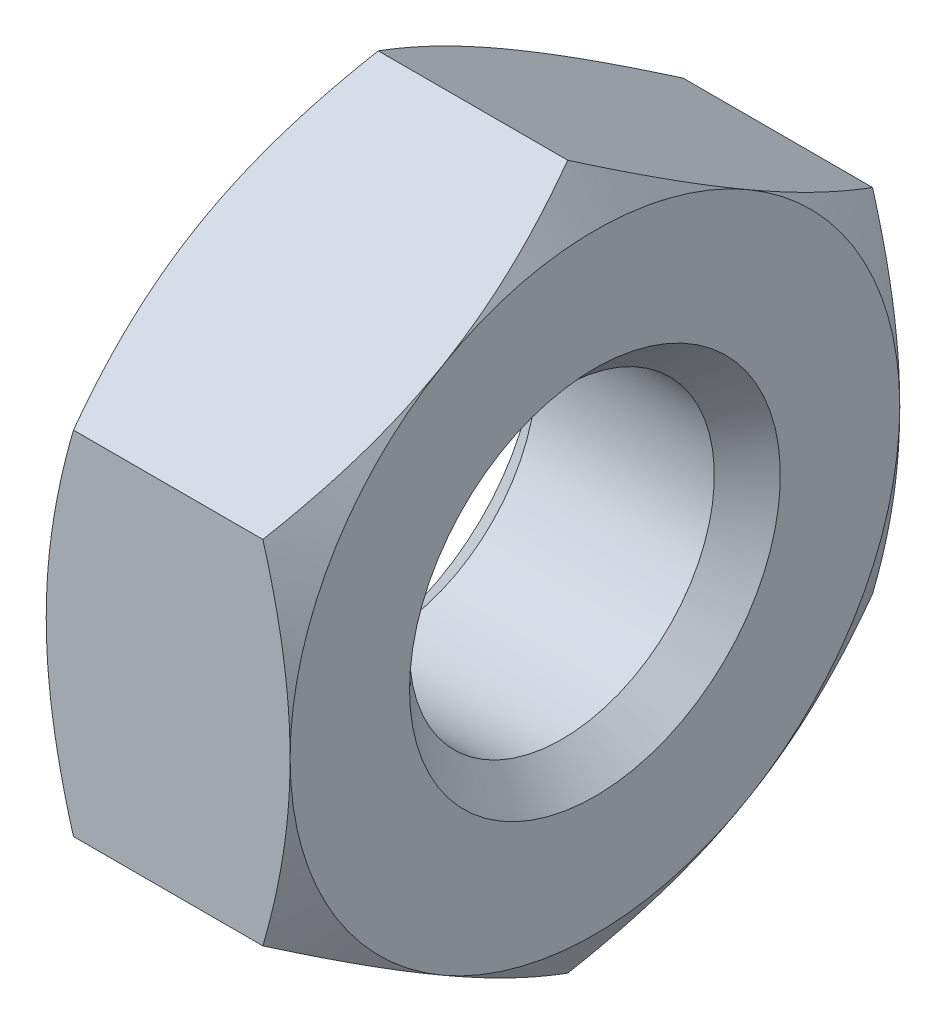
ISO-10303-21;
HEADER;
FILE_DESCRIPTION(('STEP AP214'),'2;1');
FILE_NAME('part.step','',(''),(''),'','','');
FILE_SCHEMA(('AUTOMOTIVE_DESIGN { 1 0 10303 214 1 1 1 1 }'));
ENDSEC;
DATA;
#1=APPLICATION_CONTEXT('core data for automotive mechanical design processes');
#2=APPLICATION_PROTOCOL_DEFINITION('international standard','automotive_design',2000,#1);
#3=PRODUCT_CONTEXT('',#1,'mechanical');
#4=PRODUCT('Part','Part','',(#3));
#5=PRODUCT_RELATED_PRODUCT_CATEGORY('part','',(#4));
#6=PRODUCT_DEFINITION_FORMATION('','',#4);
#7=PRODUCT_DEFINITION_CONTEXT('part definition',#1,'design');
#8=PRODUCT_DEFINITION('design','',#6,#7);
#9=PRODUCT_DEFINITION_SHAPE('','',#8);
#10=(LENGTH_UNIT() NAMED_UNIT(*) SI_UNIT(.MILLI.,.METRE.));
#11=(NAMED_UNIT(*) PLANE_ANGLE_UNIT() SI_UNIT($,.RADIAN.));
#12=(NAMED_UNIT(*) SI_UNIT($,.STERADIAN.) SOLID_ANGLE_UNIT());
#13=UNCERTAINTY_MEASURE_WITH_UNIT(LENGTH_MEASURE(1.E-05),#10,'distance_accuracy_value','');
#14=(GEOMETRIC_REPRESENTATION_CONTEXT(3) GLOBAL_UNCERTAINTY_ASSIGNED_CONTEXT((#13)) GLOBAL_UNIT_ASSIGNED_CONTEXT((#10,
#11,#12)) REPRESENTATION_CONTEXT('',''));
#15=CARTESIAN_POINT('',(0.,0.,0.));
#16=DIRECTION('',(0.,0.,1.));
#17=DIRECTION('',(1.,0.,0.));
#18=AXIS2_PLACEMENT_3D('',#15,#16,#17);
#19=CARTESIAN_POINT('',(0.,0.,0.));
#20=DIRECTION('',(1.,0.,0.));
#21=DIRECTION('',(0.,0.,-1.));
#22=AXIS2_PLACEMENT_3D('',#19,#20,#21);
#23=CONICAL_SURFACE('',#22,2.,1.0471975511966);
#24=CARTESIAN_POINT('',(0.178633461621249,2.30940223145904,1.99999999944489E-06));
#25=CARTESIAN_POINT('',(0.149328951990776,2.25866011643009,-0.087885921313644));
#26=CARTESIAN_POINT('',(0.122678025802622,2.207479996229,-0.176532489839423));
#27=CARTESIAN_POINT('',(0.0761596153889572,2.10423360469229,-0.355360485679156));
#28=CARTESIAN_POINT('',(0.0563085858506981,2.0521654994535,-0.445545089406573));
#29=CARTESIAN_POINT('',(0.0254090009490563,1.94867454348799,-0.624796683262704));
#30=CARTESIAN_POINT('',(0.0141547681894489,1.89726761179017,-0.71383610082456));
#31=CARTESIAN_POINT('',(0.000722030029472363,1.79421198570273,-0.89233368121383));
#32=CARTESIAN_POINT('',(-0.00146760146008391,1.74256366563992,-0.981791195688201));
#33=CARTESIAN_POINT('',(0.00309900412138308,1.64606416810295,-1.14893322832709));
#34=CARTESIAN_POINT('',(0.0087339880982772,1.60119851072437,-1.22664282642177));
#35=CARTESIAN_POINT('',(0.0265900336654409,1.51175948134918,-1.38155576947924));
#36=CARTESIAN_POINT('',(0.0388171889850589,1.46718641847169,-1.45875857903201));
#37=CARTESIAN_POINT('',(0.0693827363733964,1.37756313348883,-1.61399066216355));
#38=CARTESIAN_POINT('',(0.0878506344597719,1.33252424880493,-1.69200029875231));
#39=CARTESIAN_POINT('',(0.129764965388754,1.2431180434402,-1.84685638895596));
#40=CARTESIAN_POINT('',(0.153201556234829,1.1987495782296,-1.92370482495456));
#41=CARTESIAN_POINT('',(0.178633461621249,1.15469938367871,-2.000002));
#42=B_SPLINE_CURVE_WITH_KNOTS('',3,(#24,#25,#26,#27,#28,#29,#30,#31,#32,#33,#34,#35,#36,#37,#38,
#39,#40,#41),.UNSPECIFIED.,.F.,.F.,(4,2,2,2,2,2,2,2,4),(0.,0.317016169677224,0.634794137597965,
0.944708069734768,1.25424149376515,1.52370940950263,1.79342684652008,2.06912535534026,
2.34428277883518),.UNSPECIFIED.);
#43=CARTESIAN_POINT('',(0.,1.73205080756887,-1.));
#44=VERTEX_POINT('',#43);
#45=CARTESIAN_POINT('',(0.178632794954082,1.15470053837925,-2.));
#46=VERTEX_POINT('',#45);
#47=EDGE_CURVE('E291',#44,#46,#42,.T.);
#48=ORIENTED_EDGE('',*,*,#47,.T.);
#49=CARTESIAN_POINT('',(0.957079707292708,-3.0624903947655,-2.));
#50=CARTESIAN_POINT('',(0.914644001390111,-2.97467866129861,-2.));
#51=CARTESIAN_POINT('',(0.872630124928596,-2.88665931815098,-2.));
#52=CARTESIAN_POINT('',(0.789687077327902,-2.71009315808748,-2.));
#53=CARTESIAN_POINT('',(0.748758093980574,-2.62154625305932,-2.));
#54=CARTESIAN_POINT('',(0.668010274791025,-2.44333441845083,-2.));
#55=CARTESIAN_POINT('',(0.628199131708825,-2.35366599064497,-2.));
#56=CARTESIAN_POINT('',(0.550286752810206,-2.17359216015716,-2.));
#57=CARTESIAN_POINT('',(0.512185427868797,-2.08318679617927,-2.));
#58=CARTESIAN_POINT('',(0.437691039693281,-1.90036325541664,-2.));
#59=CARTESIAN_POINT('',(0.401324975170813,-1.80793401685831,-2.));
#60=CARTESIAN_POINT('',(0.331448473980978,-1.62200439926845,-2.));
#61=CARTESIAN_POINT('',(0.297937766003572,-1.52850412296458,-2.));
#62=CARTESIAN_POINT('',(0.234660584764218,-1.34044729948908,-2.));
#63=CARTESIAN_POINT('',(0.204886522546285,-1.24589333222641,-2.));
#64=CARTESIAN_POINT('',(0.15005352058683,-1.05544123989411,-2.));
#65=CARTESIAN_POINT('',(0.124993089811287,-0.95954355022448,-2.));
#66=CARTESIAN_POINT('',(0.0808041771807383,-0.766338288121778,-2.));
#67=CARTESIAN_POINT('',(0.0616772718879485,-0.669030348155942,-2.));
#68=CARTESIAN_POINT('',(0.0306422829910318,-0.473241940111528,-2.));
#69=CARTESIAN_POINT('',(0.0187342057093192,-0.374761471006099,-2.));
#70=CARTESIAN_POINT('',(0.00319362012458309,-0.177763607594791,-2.));
#71=CARTESIAN_POINT('',(-0.000491284856506656,-0.0792504707281105,-2.));
#72=CARTESIAN_POINT('',(0.00059795726955232,0.117696839719752,-2.));
#73=CARTESIAN_POINT('',(0.00536990829731499,0.216131027161966,-2.));
#74=CARTESIAN_POINT('',(0.026719630482926,0.454260070695126,-2.));
#75=CARTESIAN_POINT('',(0.0474764900344492,0.593581017371403,-2.));
#76=CARTESIAN_POINT('',(0.102189406498323,0.869645380356904,-2.));
#77=CARTESIAN_POINT('',(0.136160992063637,1.0063855650568,-2.));
#78=CARTESIAN_POINT('',(0.194744228548231,1.21103785924543,-2.));
#79=CARTESIAN_POINT('',(0.215841550725459,1.27999635147982,-2.));
#80=CARTESIAN_POINT('',(0.260124665059185,1.41718974913391,-2.));
#81=CARTESIAN_POINT('',(0.283309016775883,1.48542511783525,-2.));
#82=CARTESIAN_POINT('',(0.331282873018403,1.62089177879147,-2.));
#83=CARTESIAN_POINT('',(0.356062608344128,1.68812656080811,-2.));
#84=CARTESIAN_POINT('',(0.40707659139932,1.82207446438661,-2.));
#85=CARTESIAN_POINT('',(0.433311426947334,1.88878736252072,-2.));
#86=CARTESIAN_POINT('',(0.460130311841725,1.95525855693722,-2.));
#87=B_SPLINE_CURVE_WITH_KNOTS('',3,(#49,#50,#51,#52,#53,#54,#55,#56,#57,#58,#59,#60,#61,#62,#63,
#64,#65,#66,#67,#68,#69,#70,#71,#72,#73,#74,#75,#76,#77,#78,#79,#80,#81,#82,#83,#84,#85,#86),
.UNSPECIFIED.,.F.,.F.,(4,2,2,2,2,2,2,2,2,2,2,2,2,2,2,2,2,2,4),(0.,0.292587602336636,
0.585225524309967,0.879537999915476,1.17383511649728,1.47177683606816,1.76969021419367,
2.06698840049129,2.36419238554164,2.66147527141445,2.95875841765402,3.25414185051537,
3.54944858934071,3.97115971064364,4.3933678899292,4.60968319350818,4.82585032738984,
5.04080075100989,5.25583864997194),.UNSPECIFIED.);
#88=CARTESIAN_POINT('',(0.,0.,-2.));
#89=VERTEX_POINT('',#88);
#90=EDGE_CURVE('E303',#46,#89,#87,.F.);
#91=ORIENTED_EDGE('',*,*,#90,.T.);
#92=CARTESIAN_POINT('',(0.,0.,0.));
#93=DIRECTION('',(-1.,0.,0.));
#94=DIRECTION('',(0.,0.,1.));
#95=AXIS2_PLACEMENT_3D('',#92,#93,#94);
#96=CIRCLE('',#95,2.);
#97=EDGE_CURVE('E324',#44,#89,#96,.T.);
#98=ORIENTED_EDGE('',*,*,#97,.F.);
#99=EDGE_LOOP('',(#48,#91,#98));
#100=FACE_BOUND('',#99,.T.);
#101=ADVANCED_FACE('F17',(#100),#23,.T.);
#102=CARTESIAN_POINT('',(0.,-1.73205080756888,-1.));
#103=VERTEX_POINT('',#102);
#104=EDGE_CURVE('E311',#89,#103,#96,.T.);
#105=ORIENTED_EDGE('',*,*,#104,.F.);
#106=CARTESIAN_POINT('',(0.178632794954082,-1.15470053837925,-2.));
#107=VERTEX_POINT('',#106);
#108=EDGE_CURVE('E239',#89,#107,#87,.F.);
#109=ORIENTED_EDGE('',*,*,#108,.T.);
#110=CARTESIAN_POINT('',(0.178633461621249,-1.15469938367871,-2.000002));
#111=CARTESIAN_POINT('',(0.149328951990776,-1.20544149870766,-1.91211407868636));
#112=CARTESIAN_POINT('',(0.122678025802624,-1.25662161890876,-1.82346751016058));
#113=CARTESIAN_POINT('',(0.0761596153889589,-1.35986801044547,-1.64463951432084));
#114=CARTESIAN_POINT('',(0.0563085858506996,-1.41193611568425,-1.55445491059343));
#115=CARTESIAN_POINT('',(0.0254090009490579,-1.51542707164976,-1.3752033167373));
#116=CARTESIAN_POINT('',(0.0141547681894508,-1.56683400334759,-1.28616389917544));
#117=CARTESIAN_POINT('',(0.000722030029473545,-1.66988962943503,-1.10766631878617));
#118=CARTESIAN_POINT('',(-0.00146760146008372,-1.72153794949784,-1.0182088043118));
#119=CARTESIAN_POINT('',(0.00309900412138352,-1.8180374470348,-0.851066771672909));
#120=CARTESIAN_POINT('',(0.0087339880982786,-1.86290310441339,-0.773357173578231));
#121=CARTESIAN_POINT('',(0.0265900336654428,-1.95234213378857,-0.618444230520762));
#122=CARTESIAN_POINT('',(0.0388171889850603,-1.99691519666606,-0.541241420967987));
#123=CARTESIAN_POINT('',(0.0693827363733975,-2.08653848164892,-0.386009337836451));
#124=CARTESIAN_POINT('',(0.0878506344597731,-2.13157736633283,-0.307999701247692));
#125=CARTESIAN_POINT('',(0.129764965388755,-2.22098357169755,-0.153143611044045));
#126=CARTESIAN_POINT('',(0.15320155623483,-2.26535203690815,-0.0762951750454392));
#127=CARTESIAN_POINT('',(0.178633461621249,-2.30940223145904,2.00000000023283E-06));
#128=B_SPLINE_CURVE_WITH_KNOTS('',3,(#110,#111,#112,#113,#114,#115,#116,#117,#118,#119,#120,
#121,#122,#123,#124,#125,#126,#127),.UNSPECIFIED.,.F.,.F.,(4,2,2,2,2,2,2,2,4),(0.,
0.317016169677224,0.634794137597965,0.944708069734768,1.25424149376515,1.52370940950263,
1.79342684652008,2.06912535534026,2.34428277883518),.UNSPECIFIED.);
#129=EDGE_CURVE('E232',#107,#103,#128,.T.);
#130=ORIENTED_EDGE('',*,*,#129,.T.);
#131=EDGE_LOOP('',(#105,#109,#130));
#132=FACE_BOUND('',#131,.T.);
#133=ADVANCED_FACE('F247',(#132),#23,.T.);
#134=CARTESIAN_POINT('',(0.,-1.73205080756887,1.));
#135=VERTEX_POINT('',#134);
#136=EDGE_CURVE('E317',#103,#135,#96,.T.);
#137=ORIENTED_EDGE('',*,*,#136,.F.);
#138=CARTESIAN_POINT('',(0.178632794954082,-2.30940107675851,0.));
#139=VERTEX_POINT('',#138);
#140=EDGE_CURVE('E48',#103,#139,#128,.T.);
#141=ORIENTED_EDGE('',*,*,#140,.T.);
#142=CARTESIAN_POINT('',(0.178633461621249,-2.30940223145904,-1.99999999996568E-06));
#143=CARTESIAN_POINT('',(0.149328951990775,-2.25866011643009,0.0878859213136438));
#144=CARTESIAN_POINT('',(0.122678025802622,-2.207479996229,0.176532489839423));
#145=CARTESIAN_POINT('',(0.0761596153889574,-2.10423360469229,0.355360485679156));
#146=CARTESIAN_POINT('',(0.0563085858506983,-2.0521654994535,0.445545089406572));
#147=CARTESIAN_POINT('',(0.0254090009490565,-1.94867454348799,0.624796683262703));
#148=CARTESIAN_POINT('',(0.0141547681894489,-1.89726761179017,0.713836100824559));
#149=CARTESIAN_POINT('',(0.000722030029472262,-1.79421198570273,0.892333681213829));
#150=CARTESIAN_POINT('',(-0.00146760146008407,-1.74256366563992,0.9817911956882));
#151=CARTESIAN_POINT('',(0.00309900412138286,-1.64606416810295,1.14893322832709));
#152=CARTESIAN_POINT('',(0.00873398809827699,-1.60119851072437,1.22664282642177));
#153=CARTESIAN_POINT('',(0.0265900336654407,-1.51175948134918,1.38155576947924));
#154=CARTESIAN_POINT('',(0.0388171889850586,-1.46718641847169,1.45875857903201));
#155=CARTESIAN_POINT('',(0.0693827363733962,-1.37756313348883,1.61399066216355));
#156=CARTESIAN_POINT('',(0.0878506344597717,-1.33252424880493,1.69200029875231));
#157=CARTESIAN_POINT('',(0.129764965388754,-1.2431180434402,1.84685638895596));
#158=CARTESIAN_POINT('',(0.15320155623483,-1.1987495782296,1.92370482495456));
#159=CARTESIAN_POINT('',(0.178633461621249,-1.15469938367871,2.000002));
#160=B_SPLINE_CURVE_WITH_KNOTS('',3,(#142,#143,#144,#145,#146,#147,#148,#149,#150,#151,#152,
#153,#154,#155,#156,#157,#158,#159),.UNSPECIFIED.,.F.,.F.,(4,2,2,2,2,2,2,2,4),(0.,
0.317016169677224,0.634794137597964,0.944708069734767,1.25424149376515,1.52370940950263,
1.79342684652008,2.06912535534026,2.34428277883518),.UNSPECIFIED.);
#161=EDGE_CURVE('E266',#139,#135,#160,.T.);
#162=ORIENTED_EDGE('',*,*,#161,.T.);
#163=EDGE_LOOP('',(#137,#141,#162));
#164=FACE_BOUND('',#163,.T.);
#165=ADVANCED_FACE('F318',(#164),#23,.T.);
#166=CARTESIAN_POINT('',(0.178633461621249,1.15469938367871,2.000002));
#167=CARTESIAN_POINT('',(0.149328951990777,1.20544149870766,1.91211407868636));
#168=CARTESIAN_POINT('',(0.122678025802624,1.25662161890876,1.82346751016058));
#169=CARTESIAN_POINT('',(0.0761596153889588,1.35986801044547,1.64463951432085));
#170=CARTESIAN_POINT('',(0.0563085858506996,1.41193611568425,1.55445491059343));
#171=CARTESIAN_POINT('',(0.0254090009490579,1.51542707164976,1.3752033167373));
#172=CARTESIAN_POINT('',(0.0141547681894507,1.56683400334759,1.28616389917544));
#173=CARTESIAN_POINT('',(0.000722030029473479,1.66988962943503,1.10766631878617));
#174=CARTESIAN_POINT('',(-0.00146760146008376,1.72153794949784,1.0182088043118));
#175=CARTESIAN_POINT('',(0.00309900412138348,1.8180374470348,0.851066771672909));
#176=CARTESIAN_POINT('',(0.00873398809827855,1.86290310441339,0.77335717357823));
#177=CARTESIAN_POINT('',(0.0265900336654428,1.95234213378857,0.618444230520762));
#178=CARTESIAN_POINT('',(0.0388171889850603,1.99691519666606,0.541241420967987));
#179=CARTESIAN_POINT('',(0.0693827363733975,2.08653848164892,0.386009337836451));
#180=CARTESIAN_POINT('',(0.0878506344597731,2.13157736633283,0.307999701247692));
#181=CARTESIAN_POINT('',(0.129764965388755,2.22098357169756,0.153143611044044));
#182=CARTESIAN_POINT('',(0.15320155623483,2.26535203690815,0.0762951750454389));
#183=CARTESIAN_POINT('',(0.178633461621249,2.30940223145904,-2.00000000056382E-06));
#184=B_SPLINE_CURVE_WITH_KNOTS('',3,(#166,#167,#168,#169,#170,#171,#172,#173,#174,#175,#176,
#177,#178,#179,#180,#181,#182,#183),.UNSPECIFIED.,.F.,.F.,(4,2,2,2,2,2,2,2,4),(0.,
0.317016169677223,0.634794137597965,0.944708069734768,1.25424149376515,1.52370940950263,
1.79342684652008,2.06912535534026,2.34428277883518),.UNSPECIFIED.);
#185=CARTESIAN_POINT('',(0.,1.73205080756888,1.));
#186=VERTEX_POINT('',#185);
#187=CARTESIAN_POINT('',(0.178632794954082,2.30940107675851,0.));
#188=VERTEX_POINT('',#187);
#189=EDGE_CURVE('E272',#186,#188,#184,.T.);
#190=ORIENTED_EDGE('',*,*,#189,.T.);
#191=EDGE_CURVE('E233',#188,#44,#42,.T.);
#192=ORIENTED_EDGE('',*,*,#191,.T.);
#193=EDGE_CURVE('E329',#186,#44,#96,.T.);
#194=ORIENTED_EDGE('',*,*,#193,.F.);
#195=EDGE_LOOP('',(#190,#192,#194));
#196=FACE_BOUND('',#195,.T.);
#197=ADVANCED_FACE('F363',(#196),#23,.T.);
#198=CARTESIAN_POINT('',(0.,0.,2.));
#199=VERTEX_POINT('',#198);
#200=EDGE_CURVE('E148',#135,#199,#96,.T.);
#201=ORIENTED_EDGE('',*,*,#200,.F.);
#202=CARTESIAN_POINT('',(0.178632794954082,-1.15470053837925,2.));
#203=VERTEX_POINT('',#202);
#204=EDGE_CURVE('E40',#135,#203,#160,.T.);
#205=ORIENTED_EDGE('',*,*,#204,.T.);
#206=CARTESIAN_POINT('',(0.957079707292707,-3.0624903947655,2.));
#207=CARTESIAN_POINT('',(0.914644001390111,-2.97467866129861,2.));
#208=CARTESIAN_POINT('',(0.872630124928597,-2.88665931815098,2.));
#209=CARTESIAN_POINT('',(0.789687077327902,-2.71009315808748,2.));
#210=CARTESIAN_POINT('',(0.748758093980575,-2.62154625305932,2.));
#211=CARTESIAN_POINT('',(0.668010274791025,-2.44333441845083,2.));
#212=CARTESIAN_POINT('',(0.628199131708826,-2.35366599064496,2.));
#213=CARTESIAN_POINT('',(0.550286752810207,-2.17359216015716,2.));
#214=CARTESIAN_POINT('',(0.512185427868797,-2.08318679617927,2.));
#215=CARTESIAN_POINT('',(0.437691039693282,-1.90036325541664,2.));
#216=CARTESIAN_POINT('',(0.401324975170814,-1.80793401685831,2.));
#217=CARTESIAN_POINT('',(0.331448473980978,-1.62200439926845,2.));
#218=CARTESIAN_POINT('',(0.297937766003572,-1.52850412296458,2.));
#219=CARTESIAN_POINT('',(0.234660584764219,-1.34044729948908,2.));
#220=CARTESIAN_POINT('',(0.204886522546285,-1.2458933322264,2.));
#221=CARTESIAN_POINT('',(0.15005352058683,-1.05544123989411,2.));
#222=CARTESIAN_POINT('',(0.124993089811287,-0.959543550224477,2.));
#223=CARTESIAN_POINT('',(0.0808041771807383,-0.766338288121775,2.));
#224=CARTESIAN_POINT('',(0.0616772718879485,-0.669030348155939,2.));
#225=CARTESIAN_POINT('',(0.0306422829910318,-0.473241940111525,2.));
#226=CARTESIAN_POINT('',(0.0187342057093193,-0.374761471006096,2.));
#227=CARTESIAN_POINT('',(0.00319362012458324,-0.177763607594788,2.));
#228=CARTESIAN_POINT('',(-0.000491284856506492,-0.0792504707281078,2.));
#229=CARTESIAN_POINT('',(0.000597957269552618,0.117696839719754,2.));
#230=CARTESIAN_POINT('',(0.00536990829731541,0.216131027161969,2.));
#231=CARTESIAN_POINT('',(0.0267196304829265,0.454260070695128,2.));
#232=CARTESIAN_POINT('',(0.0474764900344494,0.593581017371405,2.));
#233=CARTESIAN_POINT('',(0.102189406498324,0.869645380356907,2.));
#234=CARTESIAN_POINT('',(0.136160992063638,1.00638556505681,2.));
#235=CARTESIAN_POINT('',(0.194744228548232,1.21103785924543,2.));
#236=CARTESIAN_POINT('',(0.215841550725459,1.27999635147982,2.));
#237=CARTESIAN_POINT('',(0.260124665059186,1.41718974913391,2.));
#238=CARTESIAN_POINT('',(0.283309016775885,1.48542511783525,2.));
#239=CARTESIAN_POINT('',(0.331282873018404,1.62089177879148,2.));
#240=CARTESIAN_POINT('',(0.35606260834413,1.68812656080811,2.));
#241=CARTESIAN_POINT('',(0.407076591399321,1.82207446438662,2.));
#242=CARTESIAN_POINT('',(0.433311426947335,1.88878736252073,2.));
#243=CARTESIAN_POINT('',(0.460130311841726,1.95525855693722,2.));
#244=B_SPLINE_CURVE_WITH_KNOTS('',3,(#206,#207,#208,#209,#210,#211,#212,#213,#214,#215,#216,
#217,#218,#219,#220,#221,#222,#223,#224,#225,#226,#227,#228,#229,#230,#231,#232,#233,#234,#235,
#236,#237,#238,#239,#240,#241,#242,#243),.UNSPECIFIED.,.F.,.F.,(4,2,2,2,2,2,2,2,2,2,2,2,2,2,2,2,
2,2,4),(0.,0.292587602336635,0.585225524309967,0.879537999915476,1.17383511649728,
1.47177683606816,1.76969021419367,2.06698840049129,2.36419238554164,2.66147527141445,
2.95875841765402,3.25414185051537,3.54944858934072,3.97115971064364,4.39336788992921,
4.60968319350818,4.82585032738984,5.0408007510099,5.25583864997195),.UNSPECIFIED.);
#245=EDGE_CURVE('E11',#203,#199,#244,.T.);
#246=ORIENTED_EDGE('',*,*,#245,.T.);
#247=EDGE_LOOP('',(#201,#205,#246));
#248=FACE_BOUND('',#247,.T.);
#249=ADVANCED_FACE('F359',(#248),#23,.T.);
#250=CARTESIAN_POINT('',(0.178632794954082,1.15470053837925,2.));
#251=VERTEX_POINT('',#250);
#252=EDGE_CURVE('E22',#199,#251,#244,.T.);
#253=ORIENTED_EDGE('',*,*,#252,.T.);
#254=EDGE_CURVE('E255',#251,#186,#184,.T.);
#255=ORIENTED_EDGE('',*,*,#254,.T.);
#256=EDGE_CURVE('E330',#199,#186,#96,.T.);
#257=ORIENTED_EDGE('',*,*,#256,.F.);
#258=EDGE_LOOP('',(#253,#255,#257));
#259=FACE_BOUND('',#258,.T.);
#260=ADVANCED_FACE('F249',(#259),#23,.T.);
#261=CARTESIAN_POINT('',(0.,0.,0.));
#262=DIRECTION('',(-1.,0.,0.));
#263=DIRECTION('',(0.,0.,1.));
#264=AXIS2_PLACEMENT_3D('',#261,#262,#263);
#265=PLANE('',#264);
#266=CARTESIAN_POINT('',(0.,0.,0.));
#267=DIRECTION('',(-1.,0.,0.));
#268=DIRECTION('',(0.,0.,1.));
#269=AXIS2_PLACEMENT_3D('',#266,#267,#268);
#270=CIRCLE('',#269,1.2165);
#271=CARTESIAN_POINT('',(0.,0.,1.2165));
#272=VERTEX_POINT('',#271);
#273=EDGE_CURVE('E343',#272,#272,#270,.T.);
#274=ORIENTED_EDGE('',*,*,#273,.F.);
#275=EDGE_LOOP('',(#274));
#276=FACE_BOUND('',#275,.T.);
#277=ORIENTED_EDGE('',*,*,#256,.T.);
#278=ORIENTED_EDGE('',*,*,#193,.T.);
#279=ORIENTED_EDGE('',*,*,#97,.T.);
#280=ORIENTED_EDGE('',*,*,#104,.T.);
#281=ORIENTED_EDGE('',*,*,#136,.T.);
#282=ORIENTED_EDGE('',*,*,#200,.T.);
#283=EDGE_LOOP('',(#277,#278,#279,#280,#281,#282));
#284=FACE_BOUND('',#283,.T.);
#285=ADVANCED_FACE('F250',(#276,#284),#265,.T.);
#286=CARTESIAN_POINT('',(1.76,-1.15470053837925,2.));
#287=DIRECTION('',(0.,0.866025403784438,-0.5));
#288=DIRECTION('',(0.,0.5,0.866025403784438));
#289=AXIS2_PLACEMENT_3D('',#286,#287,#288);
#290=PLANE('',#289);
#291=ORIENTED_EDGE('',*,*,#161,.F.);
#292=DIRECTION('',(-1.,0.,0.));
#293=VECTOR('',#292,1.);
#294=CARTESIAN_POINT('',(1.76,-2.30940107675851,0.));
#295=LINE('',#294,#293);
#296=CARTESIAN_POINT('',(1.42136720504592,-2.30940107675851,0.));
#297=VERTEX_POINT('',#296);
#298=EDGE_CURVE('E128',#297,#139,#295,.T.);
#299=ORIENTED_EDGE('',*,*,#298,.F.);
#300=CARTESIAN_POINT('',(1.42136653837875,-2.30940223145904,-1.99999999985859E-06));
#301=CARTESIAN_POINT('',(1.45067104800923,-2.25866011643009,0.087885921313644));
#302=CARTESIAN_POINT('',(1.47732197419738,-2.207479996229,0.176532489839423));
#303=CARTESIAN_POINT('',(1.52384038461104,-2.10423360469229,0.355360485679156));
#304=CARTESIAN_POINT('',(1.5436914141493,-2.0521654994535,0.445545089406572));
#305=CARTESIAN_POINT('',(1.57459099905094,-1.94867454348799,0.624796683262704));
#306=CARTESIAN_POINT('',(1.58584523181055,-1.89726761179017,0.713836100824559));
#307=CARTESIAN_POINT('',(1.59927796997053,-1.79421198570273,0.892333681213829));
#308=CARTESIAN_POINT('',(1.60146760146008,-1.74256366563992,0.9817911956882));
#309=CARTESIAN_POINT('',(1.59690099587862,-1.64606416810295,1.14893322832709));
#310=CARTESIAN_POINT('',(1.59126601190172,-1.60119851072437,1.22664282642177));
#311=CARTESIAN_POINT('',(1.57340996633456,-1.51175948134918,1.38155576947924));
#312=CARTESIAN_POINT('',(1.56118281101494,-1.46718641847169,1.45875857903201));
#313=CARTESIAN_POINT('',(1.5306172636266,-1.37756313348883,1.61399066216355));
#314=CARTESIAN_POINT('',(1.51214936554023,-1.33252424880493,1.69200029875231));
#315=CARTESIAN_POINT('',(1.47023503461125,-1.2431180434402,1.84685638895596));
#316=CARTESIAN_POINT('',(1.44679844376517,-1.1987495782296,1.92370482495456));
#317=CARTESIAN_POINT('',(1.42136653837875,-1.15469938367871,2.000002));
#318=B_SPLINE_CURVE_WITH_KNOTS('',3,(#300,#301,#302,#303,#304,#305,#306,#307,#308,#309,#310,
#311,#312,#313,#314,#315,#316,#317),.UNSPECIFIED.,.F.,.F.,(4,2,2,2,2,2,2,2,4),(0.,
0.317016169677224,0.634794137597964,0.944708069734767,1.25424149376515,1.52370940950263,
1.79342684652008,2.06912535534026,2.34428277883518),.UNSPECIFIED.);
#319=CARTESIAN_POINT('',(1.6,-1.73205080756887,1.));
#320=VERTEX_POINT('',#319);
#321=EDGE_CURVE('E605',#297,#320,#318,.T.);
#322=ORIENTED_EDGE('',*,*,#321,.T.);
#323=CARTESIAN_POINT('',(1.42136720504592,-1.15470053837925,2.));
#324=VERTEX_POINT('',#323);
#325=EDGE_CURVE('E134',#320,#324,#318,.T.);
#326=ORIENTED_EDGE('',*,*,#325,.T.);
#327=DIRECTION('',(-1.,0.,0.));
#328=VECTOR('',#327,1.);
#329=CARTESIAN_POINT('',(1.76,-1.15470053837925,2.));
#330=LINE('',#329,#328);
#331=EDGE_CURVE('E151',#324,#203,#330,.T.);
#332=ORIENTED_EDGE('',*,*,#331,.T.);
#333=ORIENTED_EDGE('',*,*,#204,.F.);
#334=EDGE_LOOP('',(#291,#299,#322,#326,#332,#333));
#335=FACE_BOUND('',#334,.T.);
#336=ADVANCED_FACE('F19',(#335),#290,.F.);
#337=CARTESIAN_POINT('',(1.76,-2.30940107675851,0.));
#338=DIRECTION('',(0.,0.866025403784439,0.5));
#339=DIRECTION('',(0.,-0.5,0.866025403784439));
#340=AXIS2_PLACEMENT_3D('',#337,#338,#339);
#341=PLANE('',#340);
#342=ORIENTED_EDGE('',*,*,#129,.F.);
#343=DIRECTION('',(-1.,0.,0.));
#344=VECTOR('',#343,1.);
#345=CARTESIAN_POINT('',(1.76,-1.15470053837925,-2.));
#346=LINE('',#345,#344);
#347=CARTESIAN_POINT('',(1.42136720504592,-1.15470053837925,-2.));
#348=VERTEX_POINT('',#347);
#349=EDGE_CURVE('E614',#348,#107,#346,.T.);
#350=ORIENTED_EDGE('',*,*,#349,.F.);
#351=CARTESIAN_POINT('',(1.42136653837875,-1.15469938367871,-2.000002));
#352=CARTESIAN_POINT('',(1.45067104800922,-1.20544149870766,-1.91211407868636));
#353=CARTESIAN_POINT('',(1.47732197419738,-1.25662161890876,-1.82346751016058));
#354=CARTESIAN_POINT('',(1.52384038461104,-1.35986801044547,-1.64463951432084));
#355=CARTESIAN_POINT('',(1.5436914141493,-1.41193611568425,-1.55445491059343));
#356=CARTESIAN_POINT('',(1.57459099905094,-1.51542707164976,-1.3752033167373));
#357=CARTESIAN_POINT('',(1.58584523181055,-1.56683400334759,-1.28616389917544));
#358=CARTESIAN_POINT('',(1.59927796997053,-1.66988962943503,-1.10766631878617));
#359=CARTESIAN_POINT('',(1.60146760146008,-1.72153794949784,-1.0182088043118));
#360=CARTESIAN_POINT('',(1.59690099587862,-1.8180374470348,-0.851066771672909));
#361=CARTESIAN_POINT('',(1.59126601190172,-1.86290310441339,-0.773357173578231));
#362=CARTESIAN_POINT('',(1.57340996633456,-1.95234213378857,-0.618444230520762));
#363=CARTESIAN_POINT('',(1.56118281101494,-1.99691519666606,-0.541241420967987));
#364=CARTESIAN_POINT('',(1.5306172636266,-2.08653848164892,-0.386009337836451));
#365=CARTESIAN_POINT('',(1.51214936554023,-2.13157736633283,-0.307999701247692));
#366=CARTESIAN_POINT('',(1.47023503461125,-2.22098357169755,-0.153143611044045));
#367=CARTESIAN_POINT('',(1.44679844376517,-2.26535203690815,-0.0762951750454397));
#368=CARTESIAN_POINT('',(1.42136653837875,-2.30940223145904,1.99999999972876E-06));
#369=B_SPLINE_CURVE_WITH_KNOTS('',3,(#351,#352,#353,#354,#355,#356,#357,#358,#359,#360,#361,
#362,#363,#364,#365,#366,#367,#368),.UNSPECIFIED.,.F.,.F.,(4,2,2,2,2,2,2,2,4),(0.,
0.317016169677224,0.634794137597965,0.944708069734768,1.25424149376515,1.52370940950263,
1.79342684652008,2.06912535534026,2.34428277883518),.UNSPECIFIED.);
#370=CARTESIAN_POINT('',(1.6,-1.73205080756888,-1.));
#371=VERTEX_POINT('',#370);
#372=EDGE_CURVE('E210',#348,#371,#369,.T.);
#373=ORIENTED_EDGE('',*,*,#372,.T.);
#374=EDGE_CURVE('E203',#371,#297,#369,.T.);
#375=ORIENTED_EDGE('',*,*,#374,.T.);
#376=ORIENTED_EDGE('',*,*,#298,.T.);
#377=ORIENTED_EDGE('',*,*,#140,.F.);
#378=EDGE_LOOP('',(#342,#350,#373,#375,#376,#377));
#379=FACE_BOUND('',#378,.T.);
#380=ADVANCED_FACE('F218',(#379),#341,.F.);
#381=CARTESIAN_POINT('',(1.76,-1.15470053837925,-2.));
#382=DIRECTION('',(0.,0.,1.));
#383=DIRECTION('',(0.,-1.,0.));
#384=AXIS2_PLACEMENT_3D('',#381,#382,#383);
#385=PLANE('',#384);
#386=ORIENTED_EDGE('',*,*,#90,.F.);
#387=DIRECTION('',(-1.,0.,0.));
#388=VECTOR('',#387,1.);
#389=CARTESIAN_POINT('',(1.76,1.15470053837925,-2.));
#390=LINE('',#389,#388);
#391=CARTESIAN_POINT('',(1.42136720504592,1.15470053837925,-2.));
#392=VERTEX_POINT('',#391);
#393=EDGE_CURVE('E616',#392,#46,#390,.T.);
#394=ORIENTED_EDGE('',*,*,#393,.F.);
#395=CARTESIAN_POINT('',(0.642920292707295,-3.0624903947655,-2.));
#396=CARTESIAN_POINT('',(0.68535599860989,-2.97467866129861,-2.));
#397=CARTESIAN_POINT('',(0.727369875071404,-2.88665931815098,-2.));
#398=CARTESIAN_POINT('',(0.810312922672099,-2.71009315808748,-2.));
#399=CARTESIAN_POINT('',(0.851241906019427,-2.62154625305931,-2.));
#400=CARTESIAN_POINT('',(0.931989725208976,-2.44333441845083,-2.));
#401=CARTESIAN_POINT('',(0.971800868291176,-2.35366599064496,-2.));
#402=CARTESIAN_POINT('',(1.04971324718979,-2.17359216015716,-2.));
#403=CARTESIAN_POINT('',(1.0878145721312,-2.08318679617927,-2.));
#404=CARTESIAN_POINT('',(1.16230896030672,-1.90036325541664,-2.));
#405=CARTESIAN_POINT('',(1.19867502482919,-1.80793401685831,-2.));
#406=CARTESIAN_POINT('',(1.26855152601902,-1.62200439926845,-2.));
#407=CARTESIAN_POINT('',(1.30206223399643,-1.52850412296458,-2.));
#408=CARTESIAN_POINT('',(1.36533941523578,-1.34044729948908,-2.));
#409=CARTESIAN_POINT('',(1.39511347745371,-1.2458933322264,-2.));
#410=CARTESIAN_POINT('',(1.44994647941317,-1.05544123989411,-2.));
#411=CARTESIAN_POINT('',(1.47500691018871,-0.95954355022448,-2.));
#412=CARTESIAN_POINT('',(1.51919582281926,-0.766338288121778,-2.));
#413=CARTESIAN_POINT('',(1.53832272811205,-0.669030348155942,-2.));
#414=CARTESIAN_POINT('',(1.56935771700897,-0.473241940111528,-2.));
#415=CARTESIAN_POINT('',(1.58126579429068,-0.374761471006099,-2.));
#416=CARTESIAN_POINT('',(1.59680637987542,-0.17776360759479,-2.));
#417=CARTESIAN_POINT('',(1.60049128485651,-0.0792504707281104,-2.));
#418=CARTESIAN_POINT('',(1.59940204273045,0.117696839719751,-2.));
#419=CARTESIAN_POINT('',(1.59463009170268,0.216131027161966,-2.));
#420=CARTESIAN_POINT('',(1.57328036951707,0.454260070695126,-2.));
#421=CARTESIAN_POINT('',(1.55252350996555,0.593581017371403,-2.));
#422=CARTESIAN_POINT('',(1.49781059350168,0.869645380356906,-2.));
#423=CARTESIAN_POINT('',(1.46383900793636,1.00638556505681,-2.));
#424=CARTESIAN_POINT('',(1.40525577145177,1.21103785924543,-2.));
#425=CARTESIAN_POINT('',(1.38415844927454,1.27999635147982,-2.));
#426=CARTESIAN_POINT('',(1.33987533494081,1.41718974913391,-2.));
#427=CARTESIAN_POINT('',(1.31669098322412,1.48542511783525,-2.));
#428=CARTESIAN_POINT('',(1.2687171269816,1.62089177879148,-2.));
#429=CARTESIAN_POINT('',(1.24393739165587,1.68812656080811,-2.));
#430=CARTESIAN_POINT('',(1.19292340860068,1.82207446438661,-2.));
#431=CARTESIAN_POINT('',(1.16668857305266,1.88878736252073,-2.));
#432=CARTESIAN_POINT('',(1.13986968815827,1.95525855693722,-2.));
#433=B_SPLINE_CURVE_WITH_KNOTS('',3,(#395,#396,#397,#398,#399,#400,#401,#402,#403,#404,#405,
#406,#407,#408,#409,#410,#411,#412,#413,#414,#415,#416,#417,#418,#419,#420,#421,#422,#423,#424,
#425,#426,#427,#428,#429,#430,#431,#432),.UNSPECIFIED.,.F.,.F.,(4,2,2,2,2,2,2,2,2,2,2,2,2,2,2,2,
2,2,4),(0.,0.292587602336636,0.585225524309967,0.879537999915477,1.17383511649728,
1.47177683606816,1.76969021419367,2.06698840049129,2.36419238554164,2.66147527141445,
2.95875841765402,3.25414185051537,3.54944858934071,3.97115971064364,4.39336788992921,
4.60968319350818,4.82585032738984,5.0408007510099,5.25583864997195),.UNSPECIFIED.);
#434=CARTESIAN_POINT('',(1.6,0.,-2.));
#435=VERTEX_POINT('',#434);
#436=EDGE_CURVE('E275',#392,#435,#433,.F.);
#437=ORIENTED_EDGE('',*,*,#436,.T.);
#438=EDGE_CURVE('E211',#435,#348,#433,.F.);
#439=ORIENTED_EDGE('',*,*,#438,.T.);
#440=ORIENTED_EDGE('',*,*,#349,.T.);
#441=ORIENTED_EDGE('',*,*,#108,.F.);
#442=EDGE_LOOP('',(#386,#394,#437,#439,#440,#441));
#443=FACE_BOUND('',#442,.T.);
#444=ADVANCED_FACE('F221',(#443),#385,.F.);
#445=CARTESIAN_POINT('',(1.76,1.15470053837925,-2.));
#446=DIRECTION('',(0.,-0.866025403784438,0.5));
#447=DIRECTION('',(0.,-0.5,-0.866025403784439));
#448=AXIS2_PLACEMENT_3D('',#445,#446,#447);
#449=PLANE('',#448);
#450=ORIENTED_EDGE('',*,*,#191,.F.);
#451=DIRECTION('',(-1.,0.,0.));
#452=VECTOR('',#451,1.);
#453=CARTESIAN_POINT('',(1.76,2.30940107675851,0.));
#454=LINE('',#453,#452);
#455=CARTESIAN_POINT('',(1.42136720504592,2.30940107675851,0.));
#456=VERTEX_POINT('',#455);
#457=EDGE_CURVE('E599',#456,#188,#454,.T.);
#458=ORIENTED_EDGE('',*,*,#457,.F.);
#459=CARTESIAN_POINT('',(1.42136653837875,2.30940223145904,1.99999999944489E-06));
#460=CARTESIAN_POINT('',(1.45067104800923,2.25866011643009,-0.087885921313644));
#461=CARTESIAN_POINT('',(1.47732197419738,2.207479996229,-0.176532489839423));
#462=CARTESIAN_POINT('',(1.52384038461104,2.10423360469229,-0.355360485679156));
#463=CARTESIAN_POINT('',(1.5436914141493,2.0521654994535,-0.445545089406573));
#464=CARTESIAN_POINT('',(1.57459099905094,1.94867454348799,-0.624796683262705));
#465=CARTESIAN_POINT('',(1.58584523181055,1.89726761179017,-0.71383610082456));
#466=CARTESIAN_POINT('',(1.59927796997053,1.79421198570273,-0.89233368121383));
#467=CARTESIAN_POINT('',(1.60146760146008,1.74256366563992,-0.981791195688201));
#468=CARTESIAN_POINT('',(1.59690099587862,1.64606416810295,-1.14893322832709));
#469=CARTESIAN_POINT('',(1.59126601190172,1.60119851072437,-1.22664282642177));
#470=CARTESIAN_POINT('',(1.57340996633456,1.51175948134918,-1.38155576947924));
#471=CARTESIAN_POINT('',(1.56118281101494,1.46718641847169,-1.45875857903201));
#472=CARTESIAN_POINT('',(1.5306172636266,1.37756313348883,-1.61399066216355));
#473=CARTESIAN_POINT('',(1.51214936554023,1.33252424880493,-1.69200029875231));
#474=CARTESIAN_POINT('',(1.47023503461125,1.2431180434402,-1.84685638895596));
#475=CARTESIAN_POINT('',(1.44679844376517,1.1987495782296,-1.92370482495456));
#476=CARTESIAN_POINT('',(1.42136653837875,1.15469938367871,-2.000002));
#477=B_SPLINE_CURVE_WITH_KNOTS('',3,(#459,#460,#461,#462,#463,#464,#465,#466,#467,#468,#469,
#470,#471,#472,#473,#474,#475,#476),.UNSPECIFIED.,.F.,.F.,(4,2,2,2,2,2,2,2,4),(0.,
0.317016169677224,0.634794137597965,0.944708069734768,1.25424149376515,1.52370940950263,
1.79342684652008,2.06912535534026,2.34428277883518),.UNSPECIFIED.);
#478=CARTESIAN_POINT('',(1.6,1.73205080756887,-1.));
#479=VERTEX_POINT('',#478);
#480=EDGE_CURVE('E196',#456,#479,#477,.T.);
#481=ORIENTED_EDGE('',*,*,#480,.T.);
#482=EDGE_CURVE('E596',#479,#392,#477,.T.);
#483=ORIENTED_EDGE('',*,*,#482,.T.);
#484=ORIENTED_EDGE('',*,*,#393,.T.);
#485=ORIENTED_EDGE('',*,*,#47,.F.);
#486=EDGE_LOOP('',(#450,#458,#481,#483,#484,#485));
#487=FACE_BOUND('',#486,.T.);
#488=ADVANCED_FACE('F442',(#487),#449,.F.);
#489=CARTESIAN_POINT('',(1.76,2.30940107675851,0.));
#490=DIRECTION('',(0.,-0.866025403784439,-0.5));
#491=DIRECTION('',(0.,0.5,-0.866025403784439));
#492=AXIS2_PLACEMENT_3D('',#489,#490,#491);
#493=PLANE('',#492);
#494=ORIENTED_EDGE('',*,*,#254,.F.);
#495=DIRECTION('',(-1.,0.,0.));
#496=VECTOR('',#495,1.);
#497=CARTESIAN_POINT('',(1.76,1.15470053837925,2.));
#498=LINE('',#497,#496);
#499=CARTESIAN_POINT('',(1.42136720504592,1.15470053837925,2.));
#500=VERTEX_POINT('',#499);
#501=EDGE_CURVE('E364',#500,#251,#498,.T.);
#502=ORIENTED_EDGE('',*,*,#501,.F.);
#503=CARTESIAN_POINT('',(1.42136653837875,1.15469938367871,2.000002));
#504=CARTESIAN_POINT('',(1.45067104800922,1.20544149870766,1.91211407868636));
#505=CARTESIAN_POINT('',(1.47732197419738,1.25662161890876,1.82346751016058));
#506=CARTESIAN_POINT('',(1.52384038461104,1.35986801044547,1.64463951432084));
#507=CARTESIAN_POINT('',(1.5436914141493,1.41193611568425,1.55445491059343));
#508=CARTESIAN_POINT('',(1.57459099905094,1.51542707164976,1.3752033167373));
#509=CARTESIAN_POINT('',(1.58584523181055,1.56683400334759,1.28616389917544));
#510=CARTESIAN_POINT('',(1.59927796997053,1.66988962943503,1.10766631878617));
#511=CARTESIAN_POINT('',(1.60146760146008,1.72153794949784,1.0182088043118));
#512=CARTESIAN_POINT('',(1.59690099587862,1.8180374470348,0.851066771672909));
#513=CARTESIAN_POINT('',(1.59126601190172,1.86290310441339,0.77335717357823));
#514=CARTESIAN_POINT('',(1.57340996633456,1.95234213378857,0.618444230520762));
#515=CARTESIAN_POINT('',(1.56118281101494,1.99691519666606,0.541241420967987));
#516=CARTESIAN_POINT('',(1.5306172636266,2.08653848164892,0.386009337836451));
#517=CARTESIAN_POINT('',(1.51214936554023,2.13157736633283,0.307999701247692));
#518=CARTESIAN_POINT('',(1.47023503461125,2.22098357169756,0.153143611044044));
#519=CARTESIAN_POINT('',(1.44679844376517,2.26535203690815,0.0762951750454389));
#520=CARTESIAN_POINT('',(1.42136653837875,2.30940223145904,-2.00000000057551E-06));
#521=B_SPLINE_CURVE_WITH_KNOTS('',3,(#503,#504,#505,#506,#507,#508,#509,#510,#511,#512,#513,
#514,#515,#516,#517,#518,#519,#520),.UNSPECIFIED.,.F.,.F.,(4,2,2,2,2,2,2,2,4),(0.,
0.317016169677224,0.634794137597965,0.944708069734768,1.25424149376515,1.52370940950263,
1.79342684652008,2.06912535534026,2.34428277883518),.UNSPECIFIED.);
#522=CARTESIAN_POINT('',(1.6,1.73205080756888,1.));
#523=VERTEX_POINT('',#522);
#524=EDGE_CURVE('E122',#500,#523,#521,.T.);
#525=ORIENTED_EDGE('',*,*,#524,.T.);
#526=EDGE_CURVE('E592',#523,#456,#521,.T.);
#527=ORIENTED_EDGE('',*,*,#526,.T.);
#528=ORIENTED_EDGE('',*,*,#457,.T.);
#529=ORIENTED_EDGE('',*,*,#189,.F.);
#530=EDGE_LOOP('',(#494,#502,#525,#527,#528,#529));
#531=FACE_BOUND('',#530,.T.);
#532=ADVANCED_FACE('F452',(#531),#493,.F.);
#533=CARTESIAN_POINT('',(1.76,1.15470053837925,2.));
#534=DIRECTION('',(0.,0.,-1.));
#535=DIRECTION('',(0.,1.,0.));
#536=AXIS2_PLACEMENT_3D('',#533,#534,#535);
#537=PLANE('',#536);
#538=ORIENTED_EDGE('',*,*,#245,.F.);
#539=ORIENTED_EDGE('',*,*,#331,.F.);
#540=CARTESIAN_POINT('',(0.642920292707296,-3.0624903947655,2.));
#541=CARTESIAN_POINT('',(0.68535599860989,-2.97467866129861,2.));
#542=CARTESIAN_POINT('',(0.727369875071404,-2.88665931815098,2.));
#543=CARTESIAN_POINT('',(0.810312922672098,-2.71009315808748,2.));
#544=CARTESIAN_POINT('',(0.851241906019426,-2.62154625305931,2.));
#545=CARTESIAN_POINT('',(0.931989725208976,-2.44333441845082,2.));
#546=CARTESIAN_POINT('',(0.971800868291175,-2.35366599064496,2.));
#547=CARTESIAN_POINT('',(1.04971324718979,-2.17359216015716,2.));
#548=CARTESIAN_POINT('',(1.0878145721312,-2.08318679617927,2.));
#549=CARTESIAN_POINT('',(1.16230896030672,-1.90036325541664,2.));
#550=CARTESIAN_POINT('',(1.19867502482919,-1.8079340168583,2.));
#551=CARTESIAN_POINT('',(1.26855152601902,-1.62200439926845,2.));
#552=CARTESIAN_POINT('',(1.30206223399643,-1.52850412296458,2.));
#553=CARTESIAN_POINT('',(1.36533941523578,-1.34044729948908,2.));
#554=CARTESIAN_POINT('',(1.39511347745372,-1.2458933322264,2.));
#555=CARTESIAN_POINT('',(1.44994647941317,-1.05544123989411,2.));
#556=CARTESIAN_POINT('',(1.47500691018871,-0.959543550224476,2.));
#557=CARTESIAN_POINT('',(1.51919582281926,-0.766338288121774,2.));
#558=CARTESIAN_POINT('',(1.53832272811205,-0.669030348155938,2.));
#559=CARTESIAN_POINT('',(1.56935771700897,-0.473241940111525,2.));
#560=CARTESIAN_POINT('',(1.58126579429068,-0.374761471006096,2.));
#561=CARTESIAN_POINT('',(1.59680637987542,-0.177763607594788,2.));
#562=CARTESIAN_POINT('',(1.60049128485651,-0.0792504707281079,2.));
#563=CARTESIAN_POINT('',(1.59940204273045,0.117696839719754,2.));
#564=CARTESIAN_POINT('',(1.59463009170268,0.216131027161969,2.));
#565=CARTESIAN_POINT('',(1.57328036951707,0.454260070695129,2.));
#566=CARTESIAN_POINT('',(1.55252350996555,0.593581017371407,2.));
#567=CARTESIAN_POINT('',(1.49781059350168,0.86964538035691,2.));
#568=CARTESIAN_POINT('',(1.46383900793636,1.00638556505681,2.));
#569=CARTESIAN_POINT('',(1.40525577145177,1.21103785924544,2.));
#570=CARTESIAN_POINT('',(1.38415844927454,1.27999635147983,2.));
#571=CARTESIAN_POINT('',(1.33987533494081,1.41718974913392,2.));
#572=CARTESIAN_POINT('',(1.31669098322411,1.48542511783526,2.));
#573=CARTESIAN_POINT('',(1.2687171269816,1.62089177879148,2.));
#574=CARTESIAN_POINT('',(1.24393739165587,1.68812656080811,2.));
#575=CARTESIAN_POINT('',(1.19292340860068,1.82207446438662,2.));
#576=CARTESIAN_POINT('',(1.16668857305266,1.88878736252073,2.));
#577=CARTESIAN_POINT('',(1.13986968815827,1.95525855693723,2.));
#578=B_SPLINE_CURVE_WITH_KNOTS('',3,(#540,#541,#542,#543,#544,#545,#546,#547,#548,#549,#550,
#551,#552,#553,#554,#555,#556,#557,#558,#559,#560,#561,#562,#563,#564,#565,#566,#567,#568,#569,
#570,#571,#572,#573,#574,#575,#576,#577),.UNSPECIFIED.,.F.,.F.,(4,2,2,2,2,2,2,2,2,2,2,2,2,2,2,2,
2,2,4),(0.,0.292587602336635,0.585225524309967,0.879537999915478,1.17383511649728,
1.47177683606817,1.76969021419367,2.06698840049129,2.36419238554164,2.66147527141445,
2.95875841765402,3.25414185051537,3.54944858934072,3.97115971064364,4.39336788992921,
4.60968319350819,4.82585032738984,5.0408007510099,5.25583864997195),.UNSPECIFIED.);
#579=CARTESIAN_POINT('',(1.6,0.,2.));
#580=VERTEX_POINT('',#579);
#581=EDGE_CURVE('E127',#324,#580,#578,.T.);
#582=ORIENTED_EDGE('',*,*,#581,.T.);
#583=EDGE_CURVE('E116',#580,#500,#578,.T.);
#584=ORIENTED_EDGE('',*,*,#583,.T.);
#585=ORIENTED_EDGE('',*,*,#501,.T.);
#586=ORIENTED_EDGE('',*,*,#252,.F.);
#587=EDGE_LOOP('',(#538,#539,#582,#584,#585,#586));
#588=FACE_BOUND('',#587,.T.);
#589=ADVANCED_FACE('F150',(#588),#537,.F.);
#590=CARTESIAN_POINT('',(1.6,0.,0.));
#591=DIRECTION('',(-1.,0.,0.));
#592=DIRECTION('',(0.,0.,1.));
#593=AXIS2_PLACEMENT_3D('',#590,#591,#592);
#594=CONICAL_SURFACE('',#593,2.,1.0471975511966);
#595=ORIENTED_EDGE('',*,*,#480,.F.);
#596=ORIENTED_EDGE('',*,*,#526,.F.);
#597=CARTESIAN_POINT('',(1.6,0.,0.));
#598=DIRECTION('',(-1.,0.,0.));
#599=DIRECTION('',(0.,0.,1.));
#600=AXIS2_PLACEMENT_3D('',#597,#598,#599);
#601=CIRCLE('',#600,2.);
#602=EDGE_CURVE('E146',#523,#479,#601,.T.);
#603=ORIENTED_EDGE('',*,*,#602,.T.);
#604=EDGE_LOOP('',(#595,#596,#603));
#605=FACE_BOUND('',#604,.T.);
#606=ADVANCED_FACE('F173',(#605),#594,.T.);
#607=ORIENTED_EDGE('',*,*,#436,.F.);
#608=ORIENTED_EDGE('',*,*,#482,.F.);
#609=EDGE_CURVE('E580',#479,#435,#601,.T.);
#610=ORIENTED_EDGE('',*,*,#609,.T.);
#611=EDGE_LOOP('',(#607,#608,#610));
#612=FACE_BOUND('',#611,.T.);
#613=ADVANCED_FACE('F167',(#612),#594,.T.);
#614=ORIENTED_EDGE('',*,*,#438,.F.);
#615=EDGE_CURVE('E575',#435,#371,#601,.T.);
#616=ORIENTED_EDGE('',*,*,#615,.T.);
#617=ORIENTED_EDGE('',*,*,#372,.F.);
#618=EDGE_LOOP('',(#614,#616,#617));
#619=FACE_BOUND('',#618,.T.);
#620=ADVANCED_FACE('F172',(#619),#594,.T.);
#621=ORIENTED_EDGE('',*,*,#374,.F.);
#622=EDGE_CURVE('E139',#371,#320,#601,.T.);
#623=ORIENTED_EDGE('',*,*,#622,.T.);
#624=ORIENTED_EDGE('',*,*,#321,.F.);
#625=EDGE_LOOP('',(#621,#623,#624));
#626=FACE_BOUND('',#625,.T.);
#627=ADVANCED_FACE('F479',(#626),#594,.T.);
#628=ORIENTED_EDGE('',*,*,#325,.F.);
#629=EDGE_CURVE('E131',#320,#580,#601,.T.);
#630=ORIENTED_EDGE('',*,*,#629,.T.);
#631=ORIENTED_EDGE('',*,*,#581,.F.);
#632=EDGE_LOOP('',(#628,#630,#631));
#633=FACE_BOUND('',#632,.T.);
#634=ADVANCED_FACE('F132',(#633),#594,.T.);
#635=CARTESIAN_POINT('',(1.6,0.,0.));
#636=DIRECTION('',(-1.,0.,0.));
#637=DIRECTION('',(0.,0.,1.));
#638=AXIS2_PLACEMENT_3D('',#635,#636,#637);
#639=PLANE('',#638);
#640=CARTESIAN_POINT('',(1.6,0.,0.));
#641=DIRECTION('',(-1.,0.,0.));
#642=DIRECTION('',(0.,0.,1.));
#643=AXIS2_PLACEMENT_3D('',#640,#641,#642);
#644=CIRCLE('',#643,1.2165);
#645=CARTESIAN_POINT('',(1.6,0.,1.2165));
#646=VERTEX_POINT('',#645);
#647=EDGE_CURVE('E140',#646,#646,#644,.T.);
#648=ORIENTED_EDGE('',*,*,#647,.T.);
#649=EDGE_LOOP('',(#648));
#650=FACE_BOUND('',#649,.T.);
#651=EDGE_CURVE('E120',#580,#523,#601,.T.);
#652=ORIENTED_EDGE('',*,*,#651,.F.);
#653=ORIENTED_EDGE('',*,*,#629,.F.);
#654=ORIENTED_EDGE('',*,*,#622,.F.);
#655=ORIENTED_EDGE('',*,*,#615,.F.);
#656=ORIENTED_EDGE('',*,*,#609,.F.);
#657=ORIENTED_EDGE('',*,*,#602,.F.);
#658=EDGE_LOOP('',(#652,#653,#654,#655,#656,#657));
#659=FACE_BOUND('',#658,.T.);
#660=ADVANCED_FACE('F143',(#650,#659),#639,.F.);
#661=ORIENTED_EDGE('',*,*,#524,.F.);
#662=ORIENTED_EDGE('',*,*,#583,.F.);
#663=ORIENTED_EDGE('',*,*,#651,.T.);
#664=EDGE_LOOP('',(#661,#662,#663));
#665=FACE_BOUND('',#664,.T.);
#666=ADVANCED_FACE('F118',(#665),#594,.T.);
#667=CARTESIAN_POINT('',(1.3835,0.,0.));
#668=DIRECTION('',(1.,0.,0.));
#669=DIRECTION('',(0.,0.,-1.));
#670=AXIS2_PLACEMENT_3D('',#667,#668,#669);
#671=CONICAL_SURFACE('',#670,1.,0.785398163397448);
#672=ORIENTED_EDGE('',*,*,#647,.F.);
#673=EDGE_LOOP('',(#672));
#674=FACE_BOUND('',#673,.T.);
#675=CARTESIAN_POINT('',(1.3835,0.,0.));
#676=DIRECTION('',(-1.,0.,0.));
#677=DIRECTION('',(0.,0.,1.));
#678=AXIS2_PLACEMENT_3D('',#675,#676,#677);
#679=CIRCLE('',#678,1.);
#680=CARTESIAN_POINT('',(1.3835,0.,1.));
#681=VERTEX_POINT('',#680);
#682=EDGE_CURVE('E335',#681,#681,#679,.T.);
#683=ORIENTED_EDGE('',*,*,#682,.T.);
#684=EDGE_LOOP('',(#683));
#685=FACE_BOUND('',#684,.T.);
#686=ADVANCED_FACE('F175',(#674,#685),#671,.F.);
#687=CARTESIAN_POINT('',(0.,0.,0.));
#688=DIRECTION('',(-1.,0.,0.));
#689=DIRECTION('',(0.,0.,1.));
#690=AXIS2_PLACEMENT_3D('',#687,#688,#689);
#691=CYLINDRICAL_SURFACE('',#690,1.);
#692=ORIENTED_EDGE('',*,*,#682,.F.);
#693=EDGE_LOOP('',(#692));
#694=FACE_BOUND('',#693,.T.);
#695=CARTESIAN_POINT('',(0.2165,0.,0.));
#696=DIRECTION('',(-1.,0.,0.));
#697=DIRECTION('',(0.,0.,1.));
#698=AXIS2_PLACEMENT_3D('',#695,#696,#697);
#699=CIRCLE('',#698,1.);
#700=CARTESIAN_POINT('',(0.2165,0.,1.));
#701=VERTEX_POINT('',#700);
#702=EDGE_CURVE('E339',#701,#701,#699,.T.);
#703=ORIENTED_EDGE('',*,*,#702,.T.);
#704=EDGE_LOOP('',(#703));
#705=FACE_BOUND('',#704,.T.);
#706=ADVANCED_FACE('F538',(#694,#705),#691,.F.);
#707=CARTESIAN_POINT('',(0.,0.,0.));
#708=DIRECTION('',(-1.,0.,0.));
#709=DIRECTION('',(0.,0.,1.));
#710=AXIS2_PLACEMENT_3D('',#707,#708,#709);
#711=CONICAL_SURFACE('',#710,1.2165,0.785398163397449);
#712=ORIENTED_EDGE('',*,*,#702,.F.);
#713=EDGE_LOOP('',(#712));
#714=FACE_BOUND('',#713,.T.);
#715=ORIENTED_EDGE('',*,*,#273,.T.);
#716=EDGE_LOOP('',(#715));
#717=FACE_BOUND('',#716,.T.);
#718=ADVANCED_FACE('F351',(#714,#717),#711,.F.);
#719=CLOSED_SHELL('',(#101,#133,#165,#197,#249,#260,#285,#336,#380,#444,#488,#532,#589,#606,
#613,#620,#627,#634,#660,#666,#686,#706,#718));
#720=MANIFOLD_SOLID_BREP('B1',#719);
#721=ADVANCED_BREP_SHAPE_REPRESENTATION('',(#18,#720),#14);
#722=SHAPE_DEFINITION_REPRESENTATION(#9,#721);
ENDSEC;
END-ISO-10303-21;
